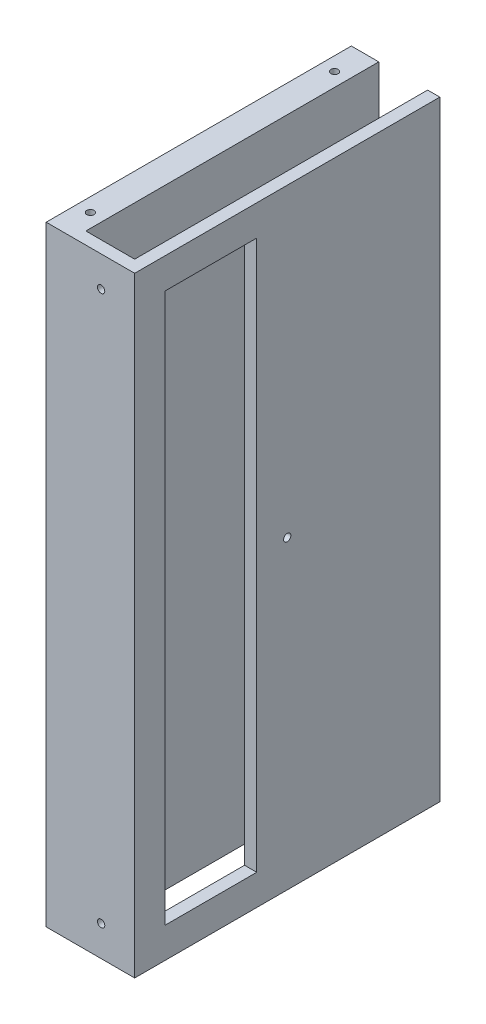
ISO-10303-21;
HEADER;
FILE_DESCRIPTION(('STEP AP214'),'2;1');
FILE_NAME('part.step','',(''),(''),'','','');
FILE_SCHEMA(('AUTOMOTIVE_DESIGN { 1 0 10303 214 1 1 1 1 }'));
ENDSEC;
DATA;
#1=APPLICATION_CONTEXT('core data for automotive mechanical design processes');
#2=APPLICATION_PROTOCOL_DEFINITION('international standard','automotive_design',2000,#1);
#3=PRODUCT_CONTEXT('',#1,'mechanical');
#4=PRODUCT('Part','Part','',(#3));
#5=PRODUCT_RELATED_PRODUCT_CATEGORY('part','',(#4));
#6=PRODUCT_DEFINITION_FORMATION('','',#4);
#7=PRODUCT_DEFINITION_CONTEXT('part definition',#1,'design');
#8=PRODUCT_DEFINITION('design','',#6,#7);
#9=PRODUCT_DEFINITION_SHAPE('','',#8);
#10=(LENGTH_UNIT() NAMED_UNIT(*) SI_UNIT(.MILLI.,.METRE.));
#11=(NAMED_UNIT(*) PLANE_ANGLE_UNIT() SI_UNIT($,.RADIAN.));
#12=(NAMED_UNIT(*) SI_UNIT($,.STERADIAN.) SOLID_ANGLE_UNIT());
#13=UNCERTAINTY_MEASURE_WITH_UNIT(LENGTH_MEASURE(1.E-05),#10,'distance_accuracy_value','');
#14=(GEOMETRIC_REPRESENTATION_CONTEXT(3) GLOBAL_UNCERTAINTY_ASSIGNED_CONTEXT((#13)) GLOBAL_UNIT_ASSIGNED_CONTEXT((#10,
#11,#12)) REPRESENTATION_CONTEXT('',''));
#15=CARTESIAN_POINT('',(0.,0.,0.));
#16=DIRECTION('',(0.,0.,1.));
#17=DIRECTION('',(1.,0.,0.));
#18=AXIS2_PLACEMENT_3D('',#15,#16,#17);
#19=CARTESIAN_POINT('',(-5.49999999999999,0.,-50.));
#20=DIRECTION('',(-1.,0.,0.));
#21=DIRECTION('',(0.,0.,1.));
#22=AXIS2_PLACEMENT_3D('',#19,#20,#21);
#23=PLANE('',#22);
#24=DIRECTION('',(0.,0.,1.));
#25=VECTOR('',#24,1.);
#26=CARTESIAN_POINT('',(-5.49999999999999,200.,-50.));
#27=LINE('',#26,#25);
#28=CARTESIAN_POINT('',(-5.49999999999999,200.,-50.));
#29=VERTEX_POINT('',#28);
#30=CARTESIAN_POINT('',(-5.49999999999998,200.,46.));
#31=VERTEX_POINT('',#30);
#32=EDGE_CURVE('E206',#29,#31,#27,.T.);
#33=ORIENTED_EDGE('',*,*,#32,.T.);
#34=DIRECTION('',(0.,1.,0.));
#35=VECTOR('',#34,1.);
#36=CARTESIAN_POINT('',(-5.49999999999998,0.,46.));
#37=LINE('',#36,#35);
#38=CARTESIAN_POINT('',(-5.49999999999998,0.,46.));
#39=VERTEX_POINT('',#38);
#40=EDGE_CURVE('E214',#39,#31,#37,.T.);
#41=ORIENTED_EDGE('',*,*,#40,.F.);
#42=DIRECTION('',(0.,0.,1.));
#43=VECTOR('',#42,1.);
#44=CARTESIAN_POINT('',(-5.49999999999999,0.,-50.));
#45=LINE('',#44,#43);
#46=CARTESIAN_POINT('',(-5.49999999999999,0.,-50.));
#47=VERTEX_POINT('',#46);
#48=EDGE_CURVE('E197',#47,#39,#45,.T.);
#49=ORIENTED_EDGE('',*,*,#48,.F.);
#50=DIRECTION('',(0.,1.,0.));
#51=VECTOR('',#50,1.);
#52=CARTESIAN_POINT('',(-5.49999999999999,0.,-50.));
#53=LINE('',#52,#51);
#54=EDGE_CURVE('E216',#47,#29,#53,.T.);
#55=ORIENTED_EDGE('',*,*,#54,.T.);
#56=EDGE_LOOP('',(#33,#41,#49,#55));
#57=FACE_BOUND('',#56,.T.);
#58=CARTESIAN_POINT('',(-5.49999999999998,100.,30.));
#59=DIRECTION('',(-1.,0.,0.));
#60=DIRECTION('',(0.,0.,1.));
#61=AXIS2_PLACEMENT_3D('',#58,#59,#60);
#62=CIRCLE('',#61,1.19999999999999);
#63=CARTESIAN_POINT('',(-5.49999999999998,100.,31.2));
#64=VERTEX_POINT('',#63);
#65=EDGE_CURVE('E151',#64,#64,#62,.F.);
#66=ORIENTED_EDGE('',*,*,#65,.F.);
#67=EDGE_LOOP('',(#66));
#68=FACE_BOUND('',#67,.T.);
#69=CARTESIAN_POINT('',(-5.49999999999999,20.,-30.));
#70=DIRECTION('',(-1.,0.,0.));
#71=DIRECTION('',(0.,0.,1.));
#72=AXIS2_PLACEMENT_3D('',#69,#70,#71);
#73=CIRCLE('',#72,1.19999999999999);
#74=CARTESIAN_POINT('',(-5.49999999999999,20.,-28.8));
#75=VERTEX_POINT('',#74);
#76=EDGE_CURVE('E409',#75,#75,#73,.F.);
#77=ORIENTED_EDGE('',*,*,#76,.F.);
#78=EDGE_LOOP('',(#77));
#79=FACE_BOUND('',#78,.T.);
#80=CARTESIAN_POINT('',(-5.49999999999999,180.,-30.));
#81=DIRECTION('',(-1.,0.,0.));
#82=DIRECTION('',(0.,0.,1.));
#83=AXIS2_PLACEMENT_3D('',#80,#81,#82);
#84=CIRCLE('',#83,1.19999999999999);
#85=CARTESIAN_POINT('',(-5.49999999999999,180.,-28.8));
#86=VERTEX_POINT('',#85);
#87=EDGE_CURVE('E403',#86,#86,#84,.F.);
#88=ORIENTED_EDGE('',*,*,#87,.F.);
#89=EDGE_LOOP('',(#88));
#90=FACE_BOUND('',#89,.T.);
#91=ADVANCED_FACE('F33',(#57,#68,#79,#90),#23,.F.);
#92=CARTESIAN_POINT('',(-14.5,200.,-50.));
#93=DIRECTION('',(0.,0.,1.));
#94=DIRECTION('',(1.,0.,0.));
#95=AXIS2_PLACEMENT_3D('',#92,#93,#94);
#96=PLANE('',#95);
#97=DIRECTION('',(-1.,0.,0.));
#98=VECTOR('',#97,1.);
#99=CARTESIAN_POINT('',(-14.5,0.,-50.));
#100=LINE('',#99,#98);
#101=CARTESIAN_POINT('',(14.5,0.,-50.));
#102=VERTEX_POINT('',#101);
#103=CARTESIAN_POINT('',(10.5,0.,-50.));
#104=VERTEX_POINT('',#103);
#105=EDGE_CURVE('E236',#102,#104,#100,.T.);
#106=ORIENTED_EDGE('',*,*,#105,.T.);
#107=DIRECTION('',(0.,1.,0.));
#108=VECTOR('',#107,1.);
#109=CARTESIAN_POINT('',(10.5,0.,-50.));
#110=LINE('',#109,#108);
#111=CARTESIAN_POINT('',(10.5,200.,-50.));
#112=VERTEX_POINT('',#111);
#113=EDGE_CURVE('E204',#104,#112,#110,.T.);
#114=ORIENTED_EDGE('',*,*,#113,.T.);
#115=DIRECTION('',(-1.,0.,0.));
#116=VECTOR('',#115,1.);
#117=CARTESIAN_POINT('',(-14.5,200.,-50.));
#118=LINE('',#117,#116);
#119=CARTESIAN_POINT('',(14.5,200.,-50.));
#120=VERTEX_POINT('',#119);
#121=EDGE_CURVE('E225',#120,#112,#118,.T.);
#122=ORIENTED_EDGE('',*,*,#121,.F.);
#123=DIRECTION('',(0.,-1.,0.));
#124=VECTOR('',#123,1.);
#125=CARTESIAN_POINT('',(14.5,200.,-50.));
#126=LINE('',#125,#124);
#127=EDGE_CURVE('E11',#120,#102,#126,.T.);
#128=ORIENTED_EDGE('',*,*,#127,.T.);
#129=EDGE_LOOP('',(#106,#114,#122,#128));
#130=FACE_BOUND('',#129,.T.);
#131=ADVANCED_FACE('F284',(#130),#96,.F.);
#132=CARTESIAN_POINT('',(14.5,200.,-50.));
#133=DIRECTION('',(-1.,0.,0.));
#134=DIRECTION('',(0.,0.,1.));
#135=AXIS2_PLACEMENT_3D('',#132,#133,#134);
#136=PLANE('',#135);
#137=CARTESIAN_POINT('',(14.5,100.,0.));
#138=DIRECTION('',(1.,0.,0.));
#139=DIRECTION('',(0.,0.,-1.));
#140=AXIS2_PLACEMENT_3D('',#137,#138,#139);
#141=CIRCLE('',#140,1.19999999999999);
#142=CARTESIAN_POINT('',(14.5,100.,-1.19999999999999));
#143=VERTEX_POINT('',#142);
#144=EDGE_CURVE('E400',#143,#143,#141,.T.);
#145=ORIENTED_EDGE('',*,*,#144,.F.);
#146=EDGE_LOOP('',(#145));
#147=FACE_BOUND('',#146,.T.);
#148=DIRECTION('',(0.,0.,-1.));
#149=VECTOR('',#148,1.);
#150=CARTESIAN_POINT('',(14.5,10.,40.));
#151=LINE('',#150,#149);
#152=CARTESIAN_POINT('',(14.5,10.,40.));
#153=VERTEX_POINT('',#152);
#154=CARTESIAN_POINT('',(14.5,10.,9.99999999999997));
#155=VERTEX_POINT('',#154);
#156=EDGE_CURVE('E178',#153,#155,#151,.T.);
#157=ORIENTED_EDGE('',*,*,#156,.F.);
#158=DIRECTION('',(0.,-1.,0.));
#159=VECTOR('',#158,1.);
#160=CARTESIAN_POINT('',(14.5,190.,40.));
#161=LINE('',#160,#159);
#162=CARTESIAN_POINT('',(14.5,190.,40.));
#163=VERTEX_POINT('',#162);
#164=EDGE_CURVE('E49',#163,#153,#161,.T.);
#165=ORIENTED_EDGE('',*,*,#164,.F.);
#166=DIRECTION('',(0.,0.,1.));
#167=VECTOR('',#166,1.);
#168=CARTESIAN_POINT('',(14.5,190.,40.));
#169=LINE('',#168,#167);
#170=CARTESIAN_POINT('',(14.5,190.,9.99999999999999));
#171=VERTEX_POINT('',#170);
#172=EDGE_CURVE('E183',#171,#163,#169,.T.);
#173=ORIENTED_EDGE('',*,*,#172,.F.);
#174=DIRECTION('',(0.,1.,0.));
#175=VECTOR('',#174,1.);
#176=CARTESIAN_POINT('',(14.5,190.,9.99999999999999));
#177=LINE('',#176,#175);
#178=EDGE_CURVE('E180',#155,#171,#177,.T.);
#179=ORIENTED_EDGE('',*,*,#178,.F.);
#180=EDGE_LOOP('',(#157,#165,#173,#179));
#181=FACE_BOUND('',#180,.T.);
#182=DIRECTION('',(0.,0.,-1.));
#183=VECTOR('',#182,1.);
#184=CARTESIAN_POINT('',(14.5,0.,-50.));
#185=LINE('',#184,#183);
#186=CARTESIAN_POINT('',(14.5,0.,50.));
#187=VERTEX_POINT('',#186);
#188=EDGE_CURVE('E213',#187,#102,#185,.T.);
#189=ORIENTED_EDGE('',*,*,#188,.T.);
#190=ORIENTED_EDGE('',*,*,#127,.F.);
#191=DIRECTION('',(0.,0.,-1.));
#192=VECTOR('',#191,1.);
#193=CARTESIAN_POINT('',(14.5,200.,-50.));
#194=LINE('',#193,#192);
#195=CARTESIAN_POINT('',(14.5,200.,50.));
#196=VERTEX_POINT('',#195);
#197=EDGE_CURVE('E220',#196,#120,#194,.T.);
#198=ORIENTED_EDGE('',*,*,#197,.F.);
#199=DIRECTION('',(0.,-1.,0.));
#200=VECTOR('',#199,1.);
#201=CARTESIAN_POINT('',(14.5,200.,50.));
#202=LINE('',#201,#200);
#203=EDGE_CURVE('E232',#196,#187,#202,.T.);
#204=ORIENTED_EDGE('',*,*,#203,.T.);
#205=EDGE_LOOP('',(#189,#190,#198,#204));
#206=FACE_BOUND('',#205,.T.);
#207=ADVANCED_FACE('F35',(#147,#181,#206),#136,.F.);
#208=CARTESIAN_POINT('',(-14.5,200.,-50.));
#209=VERTEX_POINT('',#208);
#210=EDGE_CURVE('E223',#29,#209,#118,.T.);
#211=ORIENTED_EDGE('',*,*,#210,.F.);
#212=ORIENTED_EDGE('',*,*,#54,.F.);
#213=CARTESIAN_POINT('',(-14.5,0.,-50.));
#214=VERTEX_POINT('',#213);
#215=EDGE_CURVE('E235',#47,#214,#100,.T.);
#216=ORIENTED_EDGE('',*,*,#215,.T.);
#217=DIRECTION('',(0.,-1.,0.));
#218=VECTOR('',#217,1.);
#219=CARTESIAN_POINT('',(-14.5,200.,-50.));
#220=LINE('',#219,#218);
#221=EDGE_CURVE('E42',#209,#214,#220,.T.);
#222=ORIENTED_EDGE('',*,*,#221,.F.);
#223=EDGE_LOOP('',(#211,#212,#216,#222));
#224=FACE_BOUND('',#223,.T.);
#225=ADVANCED_FACE('F274',(#224),#96,.F.);
#226=CARTESIAN_POINT('',(-14.5,200.,-50.));
#227=DIRECTION('',(1.,0.,0.));
#228=DIRECTION('',(0.,0.,-1.));
#229=AXIS2_PLACEMENT_3D('',#226,#227,#228);
#230=PLANE('',#229);
#231=CARTESIAN_POINT('',(-14.5,180.,-30.));
#232=DIRECTION('',(-1.,0.,0.));
#233=DIRECTION('',(0.,0.,1.));
#234=AXIS2_PLACEMENT_3D('',#231,#232,#233);
#235=CIRCLE('',#234,1.19999999999998);
#236=CARTESIAN_POINT('',(-14.5,180.,-28.8));
#237=VERTEX_POINT('',#236);
#238=EDGE_CURVE('E399',#237,#237,#235,.T.);
#239=ORIENTED_EDGE('',*,*,#238,.F.);
#240=EDGE_LOOP('',(#239));
#241=FACE_BOUND('',#240,.T.);
#242=CARTESIAN_POINT('',(-14.5,20.,-30.));
#243=DIRECTION('',(-1.,0.,0.));
#244=DIRECTION('',(0.,0.,1.));
#245=AXIS2_PLACEMENT_3D('',#242,#243,#244);
#246=CIRCLE('',#245,1.19999999999999);
#247=CARTESIAN_POINT('',(-14.5,20.,-28.8));
#248=VERTEX_POINT('',#247);
#249=EDGE_CURVE('E406',#248,#248,#246,.T.);
#250=ORIENTED_EDGE('',*,*,#249,.F.);
#251=EDGE_LOOP('',(#250));
#252=FACE_BOUND('',#251,.T.);
#253=CARTESIAN_POINT('',(-14.5,100.,30.));
#254=DIRECTION('',(-1.,0.,0.));
#255=DIRECTION('',(0.,0.,1.));
#256=AXIS2_PLACEMENT_3D('',#253,#254,#255);
#257=CIRCLE('',#256,1.19999999999999);
#258=CARTESIAN_POINT('',(-14.5,100.,31.2));
#259=VERTEX_POINT('',#258);
#260=EDGE_CURVE('E412',#259,#259,#257,.T.);
#261=ORIENTED_EDGE('',*,*,#260,.F.);
#262=EDGE_LOOP('',(#261));
#263=FACE_BOUND('',#262,.T.);
#264=DIRECTION('',(0.,0.,1.));
#265=VECTOR('',#264,1.);
#266=CARTESIAN_POINT('',(-14.5,0.,-50.));
#267=LINE('',#266,#265);
#268=CARTESIAN_POINT('',(-14.5,0.,50.));
#269=VERTEX_POINT('',#268);
#270=EDGE_CURVE('E239',#214,#269,#267,.T.);
#271=ORIENTED_EDGE('',*,*,#270,.T.);
#272=DIRECTION('',(0.,-1.,0.));
#273=VECTOR('',#272,1.);
#274=CARTESIAN_POINT('',(-14.5,200.,50.));
#275=LINE('',#274,#273);
#276=CARTESIAN_POINT('',(-14.5,200.,50.));
#277=VERTEX_POINT('',#276);
#278=EDGE_CURVE('E244',#277,#269,#275,.T.);
#279=ORIENTED_EDGE('',*,*,#278,.F.);
#280=DIRECTION('',(0.,0.,1.));
#281=VECTOR('',#280,1.);
#282=CARTESIAN_POINT('',(-14.5,200.,-50.));
#283=LINE('',#282,#281);
#284=EDGE_CURVE('E228',#209,#277,#283,.T.);
#285=ORIENTED_EDGE('',*,*,#284,.F.);
#286=ORIENTED_EDGE('',*,*,#221,.T.);
#287=EDGE_LOOP('',(#271,#279,#285,#286));
#288=FACE_BOUND('',#287,.T.);
#289=ADVANCED_FACE('F252',(#241,#252,#263,#288),#230,.F.);
#290=CARTESIAN_POINT('',(-14.5,200.,50.));
#291=DIRECTION('',(0.,0.,-1.));
#292=DIRECTION('',(-1.,0.,0.));
#293=AXIS2_PLACEMENT_3D('',#290,#291,#292);
#294=PLANE('',#293);
#295=CARTESIAN_POINT('',(3.5,10.,50.));
#296=DIRECTION('',(0.,0.,1.));
#297=DIRECTION('',(1.,0.,0.));
#298=AXIS2_PLACEMENT_3D('',#295,#296,#297);
#299=CIRCLE('',#298,1.19999999999999);
#300=CARTESIAN_POINT('',(4.69999999999999,10.,50.));
#301=VERTEX_POINT('',#300);
#302=EDGE_CURVE('E386',#301,#301,#299,.T.);
#303=ORIENTED_EDGE('',*,*,#302,.F.);
#304=EDGE_LOOP('',(#303));
#305=FACE_BOUND('',#304,.T.);
#306=CARTESIAN_POINT('',(3.5,190.,50.));
#307=DIRECTION('',(0.,0.,1.));
#308=DIRECTION('',(1.,0.,0.));
#309=AXIS2_PLACEMENT_3D('',#306,#307,#308);
#310=CIRCLE('',#309,1.19999999999999);
#311=CARTESIAN_POINT('',(4.69999999999999,190.,50.));
#312=VERTEX_POINT('',#311);
#313=EDGE_CURVE('E390',#312,#312,#310,.T.);
#314=ORIENTED_EDGE('',*,*,#313,.F.);
#315=EDGE_LOOP('',(#314));
#316=FACE_BOUND('',#315,.T.);
#317=DIRECTION('',(1.,0.,0.));
#318=VECTOR('',#317,1.);
#319=CARTESIAN_POINT('',(-14.5,0.,50.));
#320=LINE('',#319,#318);
#321=EDGE_CURVE('E224',#269,#187,#320,.T.);
#322=ORIENTED_EDGE('',*,*,#321,.T.);
#323=ORIENTED_EDGE('',*,*,#203,.F.);
#324=DIRECTION('',(1.,0.,0.));
#325=VECTOR('',#324,1.);
#326=CARTESIAN_POINT('',(-14.5,200.,50.));
#327=LINE('',#326,#325);
#328=EDGE_CURVE('E230',#277,#196,#327,.T.);
#329=ORIENTED_EDGE('',*,*,#328,.F.);
#330=ORIENTED_EDGE('',*,*,#278,.T.);
#331=EDGE_LOOP('',(#322,#323,#329,#330));
#332=FACE_BOUND('',#331,.T.);
#333=ADVANCED_FACE('F263',(#305,#316,#332),#294,.F.);
#334=CARTESIAN_POINT('',(0.,200.,0.));
#335=DIRECTION('',(0.,1.,0.));
#336=DIRECTION('',(0.,0.,1.));
#337=AXIS2_PLACEMENT_3D('',#334,#335,#336);
#338=PLANE('',#337);
#339=CARTESIAN_POINT('',(-10.,200.,-40.));
#340=DIRECTION('',(0.,1.,0.));
#341=DIRECTION('',(0.,0.,1.));
#342=AXIS2_PLACEMENT_3D('',#339,#340,#341);
#343=CIRCLE('',#342,1.2);
#344=CARTESIAN_POINT('',(-10.,200.,-38.8));
#345=VERTEX_POINT('',#344);
#346=EDGE_CURVE('E157',#345,#345,#343,.T.);
#347=ORIENTED_EDGE('',*,*,#346,.F.);
#348=EDGE_LOOP('',(#347));
#349=FACE_BOUND('',#348,.T.);
#350=CARTESIAN_POINT('',(-10.,200.,40.));
#351=DIRECTION('',(0.,1.,0.));
#352=DIRECTION('',(0.,0.,1.));
#353=AXIS2_PLACEMENT_3D('',#350,#351,#352);
#354=CIRCLE('',#353,1.2);
#355=CARTESIAN_POINT('',(-10.,200.,41.2));
#356=VERTEX_POINT('',#355);
#357=EDGE_CURVE('E163',#356,#356,#354,.T.);
#358=ORIENTED_EDGE('',*,*,#357,.F.);
#359=EDGE_LOOP('',(#358));
#360=FACE_BOUND('',#359,.T.);
#361=DIRECTION('',(0.,0.,-1.));
#362=VECTOR('',#361,1.);
#363=CARTESIAN_POINT('',(10.5,200.,-50.));
#364=LINE('',#363,#362);
#365=CARTESIAN_POINT('',(10.5,200.,46.));
#366=VERTEX_POINT('',#365);
#367=EDGE_CURVE('E193',#366,#112,#364,.T.);
#368=ORIENTED_EDGE('',*,*,#367,.F.);
#369=DIRECTION('',(1.,0.,0.));
#370=VECTOR('',#369,1.);
#371=CARTESIAN_POINT('',(10.5,200.,46.));
#372=LINE('',#371,#370);
#373=EDGE_CURVE('E198',#31,#366,#372,.T.);
#374=ORIENTED_EDGE('',*,*,#373,.F.);
#375=ORIENTED_EDGE('',*,*,#32,.F.);
#376=ORIENTED_EDGE('',*,*,#210,.T.);
#377=ORIENTED_EDGE('',*,*,#284,.T.);
#378=ORIENTED_EDGE('',*,*,#328,.T.);
#379=ORIENTED_EDGE('',*,*,#197,.T.);
#380=ORIENTED_EDGE('',*,*,#121,.T.);
#381=EDGE_LOOP('',(#368,#374,#375,#376,#377,#378,#379,#380));
#382=FACE_BOUND('',#381,.T.);
#383=ADVANCED_FACE('F270',(#349,#360,#382),#338,.T.);
#384=CARTESIAN_POINT('',(0.,0.,0.));
#385=DIRECTION('',(0.,1.,0.));
#386=DIRECTION('',(0.,0.,1.));
#387=AXIS2_PLACEMENT_3D('',#384,#385,#386);
#388=PLANE('',#387);
#389=CARTESIAN_POINT('',(-10.,0.,-40.));
#390=DIRECTION('',(0.,-1.,0.));
#391=DIRECTION('',(0.,0.,-1.));
#392=AXIS2_PLACEMENT_3D('',#389,#390,#391);
#393=CIRCLE('',#392,1.19999999999999);
#394=CARTESIAN_POINT('',(-10.,0.,-41.2));
#395=VERTEX_POINT('',#394);
#396=EDGE_CURVE('E145',#395,#395,#393,.T.);
#397=ORIENTED_EDGE('',*,*,#396,.F.);
#398=EDGE_LOOP('',(#397));
#399=FACE_BOUND('',#398,.T.);
#400=CARTESIAN_POINT('',(-10.,0.,40.));
#401=DIRECTION('',(0.,-1.,0.));
#402=DIRECTION('',(0.,0.,-1.));
#403=AXIS2_PLACEMENT_3D('',#400,#401,#402);
#404=CIRCLE('',#403,1.19999999999999);
#405=CARTESIAN_POINT('',(-10.,0.,38.8));
#406=VERTEX_POINT('',#405);
#407=EDGE_CURVE('E144',#406,#406,#404,.T.);
#408=ORIENTED_EDGE('',*,*,#407,.F.);
#409=EDGE_LOOP('',(#408));
#410=FACE_BOUND('',#409,.T.);
#411=DIRECTION('',(1.,0.,0.));
#412=VECTOR('',#411,1.);
#413=CARTESIAN_POINT('',(10.5,0.,46.));
#414=LINE('',#413,#412);
#415=CARTESIAN_POINT('',(10.5,0.,46.));
#416=VERTEX_POINT('',#415);
#417=EDGE_CURVE('E201',#39,#416,#414,.T.);
#418=ORIENTED_EDGE('',*,*,#417,.T.);
#419=DIRECTION('',(0.,0.,-1.));
#420=VECTOR('',#419,1.);
#421=CARTESIAN_POINT('',(10.5,0.,-50.));
#422=LINE('',#421,#420);
#423=EDGE_CURVE('E194',#416,#104,#422,.T.);
#424=ORIENTED_EDGE('',*,*,#423,.T.);
#425=ORIENTED_EDGE('',*,*,#105,.F.);
#426=ORIENTED_EDGE('',*,*,#188,.F.);
#427=ORIENTED_EDGE('',*,*,#321,.F.);
#428=ORIENTED_EDGE('',*,*,#270,.F.);
#429=ORIENTED_EDGE('',*,*,#215,.F.);
#430=ORIENTED_EDGE('',*,*,#48,.T.);
#431=EDGE_LOOP('',(#418,#424,#425,#426,#427,#428,#429,#430));
#432=FACE_BOUND('',#431,.T.);
#433=ADVANCED_FACE('F259',(#399,#410,#432),#388,.F.);
#434=CARTESIAN_POINT('',(10.5,0.,-50.));
#435=DIRECTION('',(1.,0.,0.));
#436=DIRECTION('',(0.,0.,-1.));
#437=AXIS2_PLACEMENT_3D('',#434,#435,#436);
#438=PLANE('',#437);
#439=CARTESIAN_POINT('',(10.5,100.,0.));
#440=DIRECTION('',(1.,0.,0.));
#441=DIRECTION('',(0.,0.,-1.));
#442=AXIS2_PLACEMENT_3D('',#439,#440,#441);
#443=CIRCLE('',#442,1.19999999999999);
#444=CARTESIAN_POINT('',(10.5,100.,-1.19999999999999));
#445=VERTEX_POINT('',#444);
#446=EDGE_CURVE('E396',#445,#445,#443,.F.);
#447=ORIENTED_EDGE('',*,*,#446,.F.);
#448=EDGE_LOOP('',(#447));
#449=FACE_BOUND('',#448,.T.);
#450=DIRECTION('',(0.,0.,-1.));
#451=VECTOR('',#450,1.);
#452=CARTESIAN_POINT('',(10.5,190.,40.));
#453=LINE('',#452,#451);
#454=CARTESIAN_POINT('',(10.5,190.,40.));
#455=VERTEX_POINT('',#454);
#456=CARTESIAN_POINT('',(10.5,190.,9.99999999999999));
#457=VERTEX_POINT('',#456);
#458=EDGE_CURVE('E171',#455,#457,#453,.T.);
#459=ORIENTED_EDGE('',*,*,#458,.F.);
#460=DIRECTION('',(0.,1.,0.));
#461=VECTOR('',#460,1.);
#462=CARTESIAN_POINT('',(10.5,190.,40.));
#463=LINE('',#462,#461);
#464=CARTESIAN_POINT('',(10.5,10.,40.));
#465=VERTEX_POINT('',#464);
#466=EDGE_CURVE('E174',#465,#455,#463,.T.);
#467=ORIENTED_EDGE('',*,*,#466,.F.);
#468=DIRECTION('',(0.,0.,1.));
#469=VECTOR('',#468,1.);
#470=CARTESIAN_POINT('',(10.5,10.,40.));
#471=LINE('',#470,#469);
#472=CARTESIAN_POINT('',(10.5,10.,9.99999999999997));
#473=VERTEX_POINT('',#472);
#474=EDGE_CURVE('E176',#473,#465,#471,.T.);
#475=ORIENTED_EDGE('',*,*,#474,.F.);
#476=DIRECTION('',(0.,-1.,0.));
#477=VECTOR('',#476,1.);
#478=CARTESIAN_POINT('',(10.5,190.,9.99999999999999));
#479=LINE('',#478,#477);
#480=EDGE_CURVE('E169',#457,#473,#479,.T.);
#481=ORIENTED_EDGE('',*,*,#480,.F.);
#482=EDGE_LOOP('',(#459,#467,#475,#481));
#483=FACE_BOUND('',#482,.T.);
#484=ORIENTED_EDGE('',*,*,#367,.T.);
#485=ORIENTED_EDGE('',*,*,#113,.F.);
#486=ORIENTED_EDGE('',*,*,#423,.F.);
#487=DIRECTION('',(0.,1.,0.));
#488=VECTOR('',#487,1.);
#489=CARTESIAN_POINT('',(10.5,0.,46.));
#490=LINE('',#489,#488);
#491=EDGE_CURVE('E211',#416,#366,#490,.T.);
#492=ORIENTED_EDGE('',*,*,#491,.T.);
#493=EDGE_LOOP('',(#484,#485,#486,#492));
#494=FACE_BOUND('',#493,.T.);
#495=ADVANCED_FACE('F282',(#449,#483,#494),#438,.F.);
#496=CARTESIAN_POINT('',(10.5,0.,46.));
#497=DIRECTION('',(0.,0.,1.));
#498=DIRECTION('',(1.,0.,0.));
#499=AXIS2_PLACEMENT_3D('',#496,#497,#498);
#500=PLANE('',#499);
#501=CARTESIAN_POINT('',(3.5,10.,46.));
#502=DIRECTION('',(0.,0.,1.));
#503=DIRECTION('',(1.,0.,0.));
#504=AXIS2_PLACEMENT_3D('',#501,#502,#503);
#505=CIRCLE('',#504,1.19999999999999);
#506=CARTESIAN_POINT('',(4.69999999999999,10.,46.));
#507=VERTEX_POINT('',#506);
#508=EDGE_CURVE('E389',#507,#507,#505,.T.);
#509=ORIENTED_EDGE('',*,*,#508,.T.);
#510=EDGE_LOOP('',(#509));
#511=FACE_BOUND('',#510,.T.);
#512=CARTESIAN_POINT('',(3.5,190.,46.));
#513=DIRECTION('',(0.,0.,1.));
#514=DIRECTION('',(1.,0.,0.));
#515=AXIS2_PLACEMENT_3D('',#512,#513,#514);
#516=CIRCLE('',#515,1.19999999999999);
#517=CARTESIAN_POINT('',(4.69999999999999,190.,46.));
#518=VERTEX_POINT('',#517);
#519=EDGE_CURVE('E37',#518,#518,#516,.T.);
#520=ORIENTED_EDGE('',*,*,#519,.T.);
#521=EDGE_LOOP('',(#520));
#522=FACE_BOUND('',#521,.T.);
#523=ORIENTED_EDGE('',*,*,#373,.T.);
#524=ORIENTED_EDGE('',*,*,#491,.F.);
#525=ORIENTED_EDGE('',*,*,#417,.F.);
#526=ORIENTED_EDGE('',*,*,#40,.T.);
#527=EDGE_LOOP('',(#523,#524,#525,#526));
#528=FACE_BOUND('',#527,.T.);
#529=ADVANCED_FACE('F280',(#511,#522,#528),#500,.F.);
#530=CARTESIAN_POINT('',(-171.982875908947,190.,40.));
#531=DIRECTION('',(0.,0.,1.));
#532=DIRECTION('',(1.,0.,0.));
#533=AXIS2_PLACEMENT_3D('',#530,#531,#532);
#534=PLANE('',#533);
#535=ORIENTED_EDGE('',*,*,#466,.T.);
#536=DIRECTION('',(1.,0.,0.));
#537=VECTOR('',#536,1.);
#538=CARTESIAN_POINT('',(-171.982875908947,190.,40.));
#539=LINE('',#538,#537);
#540=EDGE_CURVE('E172',#455,#163,#539,.T.);
#541=ORIENTED_EDGE('',*,*,#540,.T.);
#542=ORIENTED_EDGE('',*,*,#164,.T.);
#543=DIRECTION('',(1.,0.,0.));
#544=VECTOR('',#543,1.);
#545=CARTESIAN_POINT('',(-171.982875908947,10.,40.));
#546=LINE('',#545,#544);
#547=EDGE_CURVE('E186',#465,#153,#546,.T.);
#548=ORIENTED_EDGE('',*,*,#547,.F.);
#549=EDGE_LOOP('',(#535,#541,#542,#548));
#550=FACE_BOUND('',#549,.T.);
#551=ADVANCED_FACE('F318',(#550),#534,.F.);
#552=CARTESIAN_POINT('',(-171.982875908947,190.,40.));
#553=DIRECTION('',(0.,1.,0.));
#554=DIRECTION('',(0.,0.,1.));
#555=AXIS2_PLACEMENT_3D('',#552,#553,#554);
#556=PLANE('',#555);
#557=ORIENTED_EDGE('',*,*,#458,.T.);
#558=DIRECTION('',(1.,0.,0.));
#559=VECTOR('',#558,1.);
#560=CARTESIAN_POINT('',(-171.982875908947,190.,10.));
#561=LINE('',#560,#559);
#562=EDGE_CURVE('E188',#457,#171,#561,.T.);
#563=ORIENTED_EDGE('',*,*,#562,.T.);
#564=ORIENTED_EDGE('',*,*,#172,.T.);
#565=ORIENTED_EDGE('',*,*,#540,.F.);
#566=EDGE_LOOP('',(#557,#563,#564,#565));
#567=FACE_BOUND('',#566,.T.);
#568=ADVANCED_FACE('F322',(#567),#556,.F.);
#569=CARTESIAN_POINT('',(-171.982875908947,190.,10.));
#570=DIRECTION('',(0.,0.,-1.));
#571=DIRECTION('',(-1.,0.,0.));
#572=AXIS2_PLACEMENT_3D('',#569,#570,#571);
#573=PLANE('',#572);
#574=ORIENTED_EDGE('',*,*,#480,.T.);
#575=DIRECTION('',(1.,0.,0.));
#576=VECTOR('',#575,1.);
#577=CARTESIAN_POINT('',(-171.982875908947,10.,9.99999999999999));
#578=LINE('',#577,#576);
#579=EDGE_CURVE('E57',#473,#155,#578,.T.);
#580=ORIENTED_EDGE('',*,*,#579,.T.);
#581=ORIENTED_EDGE('',*,*,#178,.T.);
#582=ORIENTED_EDGE('',*,*,#562,.F.);
#583=EDGE_LOOP('',(#574,#580,#581,#582));
#584=FACE_BOUND('',#583,.T.);
#585=ADVANCED_FACE('F327',(#584),#573,.F.);
#586=CARTESIAN_POINT('',(-171.982875908947,10.,40.));
#587=DIRECTION('',(0.,-1.,0.));
#588=DIRECTION('',(0.,0.,-1.));
#589=AXIS2_PLACEMENT_3D('',#586,#587,#588);
#590=PLANE('',#589);
#591=ORIENTED_EDGE('',*,*,#474,.T.);
#592=ORIENTED_EDGE('',*,*,#547,.T.);
#593=ORIENTED_EDGE('',*,*,#156,.T.);
#594=ORIENTED_EDGE('',*,*,#579,.F.);
#595=EDGE_LOOP('',(#591,#592,#593,#594));
#596=FACE_BOUND('',#595,.T.);
#597=ADVANCED_FACE('F323',(#596),#590,.F.);
#598=CARTESIAN_POINT('',(-10.,188.8,40.));
#599=DIRECTION('',(0.,1.,0.));
#600=DIRECTION('',(0.,0.,1.));
#601=AXIS2_PLACEMENT_3D('',#598,#599,#600);
#602=CONICAL_SURFACE('',#601,1.2,1.02974425867665);
#603=CARTESIAN_POINT('',(-10.,188.078967257167,40.));
#604=VERTEX_POINT('',#603);
#605=VERTEX_LOOP('',#604);
#606=FACE_BOUND('',#605,.T.);
#607=CARTESIAN_POINT('',(-10.,188.8,40.));
#608=DIRECTION('',(0.,1.,0.));
#609=DIRECTION('',(0.,0.,1.));
#610=AXIS2_PLACEMENT_3D('',#607,#608,#609);
#611=CIRCLE('',#610,1.2);
#612=CARTESIAN_POINT('',(-10.,188.8,41.2));
#613=VERTEX_POINT('',#612);
#614=EDGE_CURVE('E166',#613,#613,#611,.T.);
#615=ORIENTED_EDGE('',*,*,#614,.T.);
#616=EDGE_LOOP('',(#615));
#617=FACE_BOUND('',#616,.T.);
#618=ADVANCED_FACE('F326',(#606,#617),#602,.F.);
#619=CARTESIAN_POINT('',(-10.,200.,40.));
#620=DIRECTION('',(0.,1.,0.));
#621=DIRECTION('',(0.,0.,1.));
#622=AXIS2_PLACEMENT_3D('',#619,#620,#621);
#623=CYLINDRICAL_SURFACE('',#622,1.2);
#624=ORIENTED_EDGE('',*,*,#614,.F.);
#625=EDGE_LOOP('',(#624));
#626=FACE_BOUND('',#625,.T.);
#627=ORIENTED_EDGE('',*,*,#357,.T.);
#628=EDGE_LOOP('',(#627));
#629=FACE_BOUND('',#628,.T.);
#630=ADVANCED_FACE('F336',(#626,#629),#623,.F.);
#631=CARTESIAN_POINT('',(-10.,188.8,-40.));
#632=DIRECTION('',(0.,1.,0.));
#633=DIRECTION('',(0.,0.,1.));
#634=AXIS2_PLACEMENT_3D('',#631,#632,#633);
#635=CONICAL_SURFACE('',#634,1.2,1.02974425867665);
#636=CARTESIAN_POINT('',(-10.,188.078967257167,-40.));
#637=VERTEX_POINT('',#636);
#638=VERTEX_LOOP('',#637);
#639=FACE_BOUND('',#638,.T.);
#640=CARTESIAN_POINT('',(-10.,188.8,-40.));
#641=DIRECTION('',(0.,1.,0.));
#642=DIRECTION('',(0.,0.,1.));
#643=AXIS2_PLACEMENT_3D('',#640,#641,#642);
#644=CIRCLE('',#643,1.2);
#645=CARTESIAN_POINT('',(-10.,188.8,-38.8));
#646=VERTEX_POINT('',#645);
#647=EDGE_CURVE('E160',#646,#646,#644,.T.);
#648=ORIENTED_EDGE('',*,*,#647,.T.);
#649=EDGE_LOOP('',(#648));
#650=FACE_BOUND('',#649,.T.);
#651=ADVANCED_FACE('F340',(#639,#650),#635,.F.);
#652=CARTESIAN_POINT('',(-10.,200.,-40.));
#653=DIRECTION('',(0.,1.,0.));
#654=DIRECTION('',(0.,0.,1.));
#655=AXIS2_PLACEMENT_3D('',#652,#653,#654);
#656=CYLINDRICAL_SURFACE('',#655,1.2);
#657=ORIENTED_EDGE('',*,*,#647,.F.);
#658=EDGE_LOOP('',(#657));
#659=FACE_BOUND('',#658,.T.);
#660=ORIENTED_EDGE('',*,*,#346,.T.);
#661=EDGE_LOOP('',(#660));
#662=FACE_BOUND('',#661,.T.);
#663=ADVANCED_FACE('F344',(#659,#662),#656,.F.);
#664=CARTESIAN_POINT('',(-10.,11.2,40.));
#665=DIRECTION('',(0.,-1.,0.));
#666=DIRECTION('',(0.,0.,-1.));
#667=AXIS2_PLACEMENT_3D('',#664,#665,#666);
#668=CONICAL_SURFACE('',#667,1.19999999999999,1.02974425867665);
#669=CARTESIAN_POINT('',(-10.,11.9210327428331,40.));
#670=VERTEX_POINT('',#669);
#671=VERTEX_LOOP('',#670);
#672=FACE_BOUND('',#671,.T.);
#673=CARTESIAN_POINT('',(-10.,11.2,40.));
#674=DIRECTION('',(0.,-1.,0.));
#675=DIRECTION('',(0.,0.,-1.));
#676=AXIS2_PLACEMENT_3D('',#673,#674,#675);
#677=CIRCLE('',#676,1.19999999999999);
#678=CARTESIAN_POINT('',(-10.,11.2,38.8));
#679=VERTEX_POINT('',#678);
#680=EDGE_CURVE('E148',#679,#679,#677,.T.);
#681=ORIENTED_EDGE('',*,*,#680,.T.);
#682=EDGE_LOOP('',(#681));
#683=FACE_BOUND('',#682,.T.);
#684=ADVANCED_FACE('F348',(#672,#683),#668,.F.);
#685=CARTESIAN_POINT('',(-10.,0.,40.));
#686=DIRECTION('',(0.,-1.,0.));
#687=DIRECTION('',(0.,0.,-1.));
#688=AXIS2_PLACEMENT_3D('',#685,#686,#687);
#689=CYLINDRICAL_SURFACE('',#688,1.19999999999999);
#690=ORIENTED_EDGE('',*,*,#680,.F.);
#691=EDGE_LOOP('',(#690));
#692=FACE_BOUND('',#691,.T.);
#693=ORIENTED_EDGE('',*,*,#407,.T.);
#694=EDGE_LOOP('',(#693));
#695=FACE_BOUND('',#694,.T.);
#696=ADVANCED_FACE('F138',(#692,#695),#689,.F.);
#697=CARTESIAN_POINT('',(-10.,11.2,-40.));
#698=DIRECTION('',(0.,-1.,0.));
#699=DIRECTION('',(0.,0.,-1.));
#700=AXIS2_PLACEMENT_3D('',#697,#698,#699);
#701=CONICAL_SURFACE('',#700,1.19999999999999,1.02974425867665);
#702=CARTESIAN_POINT('',(-10.,11.9210327428331,-40.));
#703=VERTEX_POINT('',#702);
#704=VERTEX_LOOP('',#703);
#705=FACE_BOUND('',#704,.T.);
#706=CARTESIAN_POINT('',(-10.,11.2,-40.));
#707=DIRECTION('',(0.,-1.,0.));
#708=DIRECTION('',(0.,0.,-1.));
#709=AXIS2_PLACEMENT_3D('',#706,#707,#708);
#710=CIRCLE('',#709,1.19999999999999);
#711=CARTESIAN_POINT('',(-10.,11.2,-41.2));
#712=VERTEX_POINT('',#711);
#713=EDGE_CURVE('E142',#712,#712,#710,.T.);
#714=ORIENTED_EDGE('',*,*,#713,.T.);
#715=EDGE_LOOP('',(#714));
#716=FACE_BOUND('',#715,.T.);
#717=ADVANCED_FACE('F134',(#705,#716),#701,.F.);
#718=CARTESIAN_POINT('',(-10.,0.,-40.));
#719=DIRECTION('',(0.,-1.,0.));
#720=DIRECTION('',(0.,0.,-1.));
#721=AXIS2_PLACEMENT_3D('',#718,#719,#720);
#722=CYLINDRICAL_SURFACE('',#721,1.19999999999999);
#723=ORIENTED_EDGE('',*,*,#713,.F.);
#724=EDGE_LOOP('',(#723));
#725=FACE_BOUND('',#724,.T.);
#726=ORIENTED_EDGE('',*,*,#396,.T.);
#727=EDGE_LOOP('',(#726));
#728=FACE_BOUND('',#727,.T.);
#729=ADVANCED_FACE('F137',(#725,#728),#722,.F.);
#730=CARTESIAN_POINT('',(-14.5,100.,30.));
#731=DIRECTION('',(-1.,0.,0.));
#732=DIRECTION('',(0.,0.,1.));
#733=AXIS2_PLACEMENT_3D('',#730,#731,#732);
#734=CYLINDRICAL_SURFACE('',#733,1.19999999999999);
#735=ORIENTED_EDGE('',*,*,#65,.T.);
#736=EDGE_LOOP('',(#735));
#737=FACE_BOUND('',#736,.T.);
#738=ORIENTED_EDGE('',*,*,#260,.T.);
#739=EDGE_LOOP('',(#738));
#740=FACE_BOUND('',#739,.T.);
#741=ADVANCED_FACE('F358',(#737,#740),#734,.F.);
#742=CARTESIAN_POINT('',(-14.5,20.,-30.));
#743=DIRECTION('',(-1.,0.,0.));
#744=DIRECTION('',(0.,0.,1.));
#745=AXIS2_PLACEMENT_3D('',#742,#743,#744);
#746=CYLINDRICAL_SURFACE('',#745,1.19999999999999);
#747=ORIENTED_EDGE('',*,*,#76,.T.);
#748=EDGE_LOOP('',(#747));
#749=FACE_BOUND('',#748,.T.);
#750=ORIENTED_EDGE('',*,*,#249,.T.);
#751=EDGE_LOOP('',(#750));
#752=FACE_BOUND('',#751,.T.);
#753=ADVANCED_FACE('F361',(#749,#752),#746,.F.);
#754=CARTESIAN_POINT('',(-14.5,180.,-30.));
#755=DIRECTION('',(-1.,0.,0.));
#756=DIRECTION('',(0.,0.,1.));
#757=AXIS2_PLACEMENT_3D('',#754,#755,#756);
#758=CYLINDRICAL_SURFACE('',#757,1.19999999999999);
#759=ORIENTED_EDGE('',*,*,#87,.T.);
#760=EDGE_LOOP('',(#759));
#761=FACE_BOUND('',#760,.T.);
#762=ORIENTED_EDGE('',*,*,#238,.T.);
#763=EDGE_LOOP('',(#762));
#764=FACE_BOUND('',#763,.T.);
#765=ADVANCED_FACE('F365',(#761,#764),#758,.F.);
#766=CARTESIAN_POINT('',(14.5,100.,0.));
#767=DIRECTION('',(1.,0.,0.));
#768=DIRECTION('',(0.,0.,-1.));
#769=AXIS2_PLACEMENT_3D('',#766,#767,#768);
#770=CYLINDRICAL_SURFACE('',#769,1.19999999999999);
#771=ORIENTED_EDGE('',*,*,#446,.T.);
#772=EDGE_LOOP('',(#771));
#773=FACE_BOUND('',#772,.T.);
#774=ORIENTED_EDGE('',*,*,#144,.T.);
#775=EDGE_LOOP('',(#774));
#776=FACE_BOUND('',#775,.T.);
#777=ADVANCED_FACE('F369',(#773,#776),#770,.F.);
#778=CARTESIAN_POINT('',(3.5,190.,50.));
#779=DIRECTION('',(0.,0.,1.));
#780=DIRECTION('',(1.,0.,0.));
#781=AXIS2_PLACEMENT_3D('',#778,#779,#780);
#782=CYLINDRICAL_SURFACE('',#781,1.19999999999999);
#783=ORIENTED_EDGE('',*,*,#313,.T.);
#784=EDGE_LOOP('',(#783));
#785=FACE_BOUND('',#784,.T.);
#786=ORIENTED_EDGE('',*,*,#519,.F.);
#787=EDGE_LOOP('',(#786));
#788=FACE_BOUND('',#787,.T.);
#789=ADVANCED_FACE('F373',(#785,#788),#782,.F.);
#790=CARTESIAN_POINT('',(3.5,10.,50.));
#791=DIRECTION('',(0.,0.,1.));
#792=DIRECTION('',(1.,0.,0.));
#793=AXIS2_PLACEMENT_3D('',#790,#791,#792);
#794=CYLINDRICAL_SURFACE('',#793,1.19999999999999);
#795=ORIENTED_EDGE('',*,*,#302,.T.);
#796=EDGE_LOOP('',(#795));
#797=FACE_BOUND('',#796,.T.);
#798=ORIENTED_EDGE('',*,*,#508,.F.);
#799=EDGE_LOOP('',(#798));
#800=FACE_BOUND('',#799,.T.);
#801=ADVANCED_FACE('F377',(#797,#800),#794,.F.);
#802=CLOSED_SHELL('',(#91,#131,#207,#225,#289,#333,#383,#433,#495,#529,#551,#568,#585,#597,#618,
#630,#651,#663,#684,#696,#717,#729,#741,#753,#765,#777,#789,#801));
#803=MANIFOLD_SOLID_BREP('B2',#802);
#804=ADVANCED_BREP_SHAPE_REPRESENTATION('',(#18,#803),#14);
#805=SHAPE_DEFINITION_REPRESENTATION(#9,#804);
ENDSEC;
END-ISO-10303-21;
